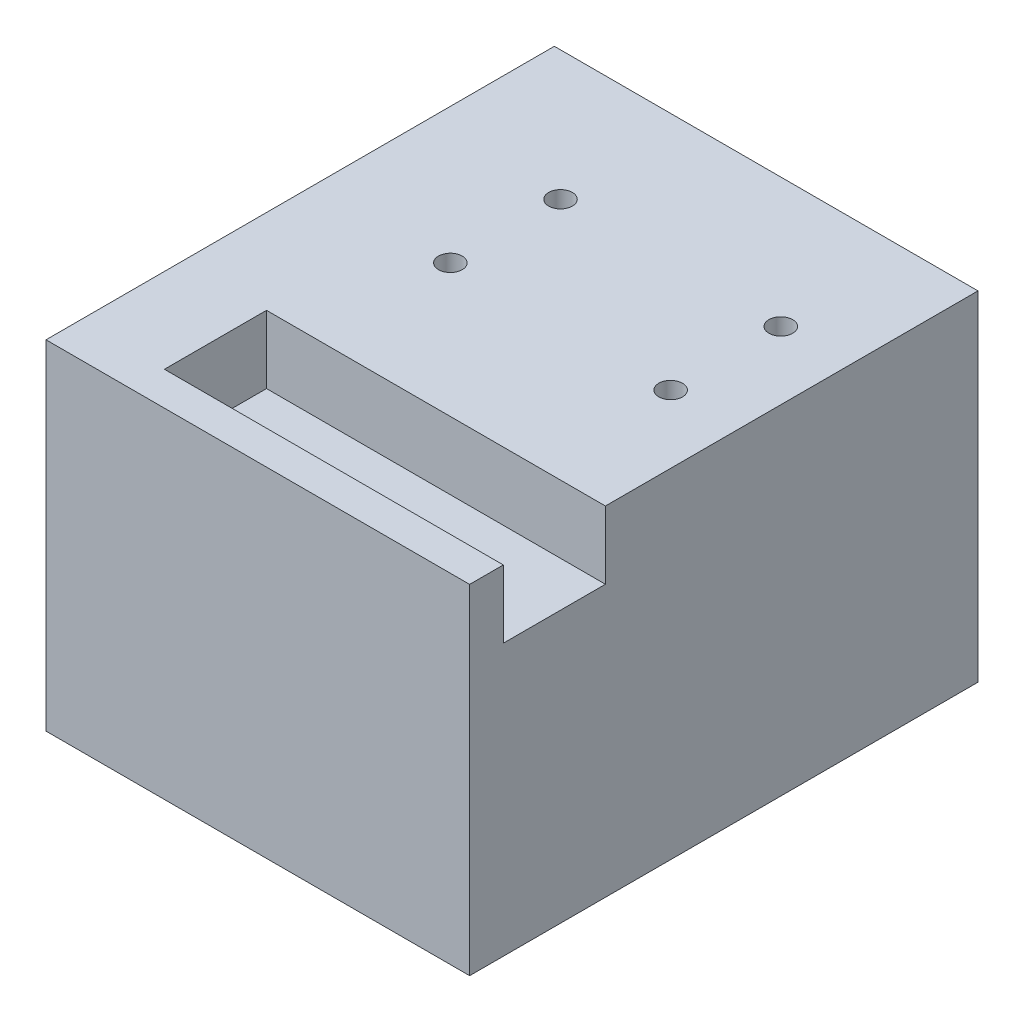
ISO-10303-21;
HEADER;
FILE_DESCRIPTION(('STEP AP214'),'2;1');
FILE_NAME('part.step','',(''),(''),'','','');
FILE_SCHEMA(('AUTOMOTIVE_DESIGN { 1 0 10303 214 1 1 1 1 }'));
ENDSEC;
DATA;
#1=APPLICATION_CONTEXT('core data for automotive mechanical design processes');
#2=APPLICATION_PROTOCOL_DEFINITION('international standard','automotive_design',2000,#1);
#3=PRODUCT_CONTEXT('',#1,'mechanical');
#4=PRODUCT('Part','Part','',(#3));
#5=PRODUCT_RELATED_PRODUCT_CATEGORY('part','',(#4));
#6=PRODUCT_DEFINITION_FORMATION('','',#4);
#7=PRODUCT_DEFINITION_CONTEXT('part definition',#1,'design');
#8=PRODUCT_DEFINITION('design','',#6,#7);
#9=PRODUCT_DEFINITION_SHAPE('','',#8);
#10=(LENGTH_UNIT() NAMED_UNIT(*) SI_UNIT(.MILLI.,.METRE.));
#11=(NAMED_UNIT(*) PLANE_ANGLE_UNIT() SI_UNIT($,.RADIAN.));
#12=(NAMED_UNIT(*) SI_UNIT($,.STERADIAN.) SOLID_ANGLE_UNIT());
#13=UNCERTAINTY_MEASURE_WITH_UNIT(LENGTH_MEASURE(1.E-05),#10,'distance_accuracy_value','');
#14=(GEOMETRIC_REPRESENTATION_CONTEXT(3) GLOBAL_UNCERTAINTY_ASSIGNED_CONTEXT((#13)) GLOBAL_UNIT_ASSIGNED_CONTEXT((#10,
#11,#12)) REPRESENTATION_CONTEXT('',''));
#15=CARTESIAN_POINT('',(0.,0.,0.));
#16=DIRECTION('',(0.,0.,1.));
#17=DIRECTION('',(1.,0.,0.));
#18=AXIS2_PLACEMENT_3D('',#15,#16,#17);
#19=CARTESIAN_POINT('',(0.,40.,0.));
#20=DIRECTION('',(0.,-1.,0.));
#21=DIRECTION('',(0.,0.,-1.));
#22=AXIS2_PLACEMENT_3D('',#19,#20,#21);
#23=PLANE('',#22);
#24=CARTESIAN_POINT('',(32.,40.,-34.725));
#25=DIRECTION('',(0.,1.,0.));
#26=DIRECTION('',(0.,0.,1.));
#27=AXIS2_PLACEMENT_3D('',#24,#25,#26);
#28=CIRCLE('',#27,1.4);
#29=CARTESIAN_POINT('',(32.,40.,-33.325));
#30=VERTEX_POINT('',#29);
#31=EDGE_CURVE('E148',#30,#30,#28,.T.);
#32=ORIENTED_EDGE('',*,*,#31,.F.);
#33=EDGE_LOOP('',(#32));
#34=FACE_BOUND('',#33,.T.);
#35=CARTESIAN_POINT('',(6.,40.,-21.725));
#36=DIRECTION('',(0.,1.,0.));
#37=DIRECTION('',(0.,0.,1.));
#38=AXIS2_PLACEMENT_3D('',#35,#36,#37);
#39=CIRCLE('',#38,1.4);
#40=CARTESIAN_POINT('',(6.,40.,-20.325));
#41=VERTEX_POINT('',#40);
#42=EDGE_CURVE('E157',#41,#41,#39,.T.);
#43=ORIENTED_EDGE('',*,*,#42,.F.);
#44=EDGE_LOOP('',(#43));
#45=FACE_BOUND('',#44,.T.);
#46=CARTESIAN_POINT('',(6.,40.,-34.725));
#47=DIRECTION('',(0.,1.,0.));
#48=DIRECTION('',(0.,0.,1.));
#49=AXIS2_PLACEMENT_3D('',#46,#47,#48);
#50=CIRCLE('',#49,1.4);
#51=CARTESIAN_POINT('',(6.,40.,-33.325));
#52=VERTEX_POINT('',#51);
#53=EDGE_CURVE('E140',#52,#52,#50,.T.);
#54=ORIENTED_EDGE('',*,*,#53,.F.);
#55=EDGE_LOOP('',(#54));
#56=FACE_BOUND('',#55,.T.);
#57=CARTESIAN_POINT('',(32.,40.,-21.725));
#58=DIRECTION('',(0.,1.,0.));
#59=DIRECTION('',(0.,0.,1.));
#60=AXIS2_PLACEMENT_3D('',#57,#58,#59);
#61=CIRCLE('',#60,1.4);
#62=CARTESIAN_POINT('',(32.,40.,-20.325));
#63=VERTEX_POINT('',#62);
#64=EDGE_CURVE('E152',#63,#63,#61,.T.);
#65=ORIENTED_EDGE('',*,*,#64,.F.);
#66=EDGE_LOOP('',(#65));
#67=FACE_BOUND('',#66,.T.);
#68=DIRECTION('',(-1.,0.,0.));
#69=VECTOR('',#68,1.);
#70=CARTESIAN_POINT('',(-10.,40.,10.));
#71=LINE('',#70,#69);
#72=CARTESIAN_POINT('',(40.,40.,10.));
#73=VERTEX_POINT('',#72);
#74=CARTESIAN_POINT('',(-10.,40.,10.));
#75=VERTEX_POINT('',#74);
#76=EDGE_CURVE('E63',#73,#75,#71,.T.);
#77=ORIENTED_EDGE('',*,*,#76,.F.);
#78=DIRECTION('',(0.,0.,-1.));
#79=VECTOR('',#78,1.);
#80=CARTESIAN_POINT('',(40.,40.,50.));
#81=LINE('',#80,#79);
#82=CARTESIAN_POINT('',(40.,40.,6.025));
#83=VERTEX_POINT('',#82);
#84=EDGE_CURVE('E212',#73,#83,#81,.T.);
#85=ORIENTED_EDGE('',*,*,#84,.T.);
#86=DIRECTION('',(1.,0.,0.));
#87=VECTOR('',#86,1.);
#88=CARTESIAN_POINT('',(0.,40.,6.025));
#89=LINE('',#88,#87);
#90=CARTESIAN_POINT('',(0.,40.,6.025));
#91=VERTEX_POINT('',#90);
#92=EDGE_CURVE('E168',#91,#83,#89,.T.);
#93=ORIENTED_EDGE('',*,*,#92,.F.);
#94=DIRECTION('',(0.,0.,1.));
#95=VECTOR('',#94,1.);
#96=CARTESIAN_POINT('',(0.,40.,-6.025));
#97=LINE('',#96,#95);
#98=CARTESIAN_POINT('',(0.,40.,-6.025));
#99=VERTEX_POINT('',#98);
#100=EDGE_CURVE('E177',#99,#91,#97,.T.);
#101=ORIENTED_EDGE('',*,*,#100,.F.);
#102=DIRECTION('',(-1.,0.,0.));
#103=VECTOR('',#102,1.);
#104=CARTESIAN_POINT('',(40.,40.,-6.02500000000002));
#105=LINE('',#104,#103);
#106=CARTESIAN_POINT('',(40.,40.,-6.02500000000002));
#107=VERTEX_POINT('',#106);
#108=EDGE_CURVE('E193',#107,#99,#105,.T.);
#109=ORIENTED_EDGE('',*,*,#108,.F.);
#110=CARTESIAN_POINT('',(40.,40.,-50.));
#111=VERTEX_POINT('',#110);
#112=EDGE_CURVE('E215',#107,#111,#81,.T.);
#113=ORIENTED_EDGE('',*,*,#112,.T.);
#114=DIRECTION('',(-1.,0.,0.));
#115=VECTOR('',#114,1.);
#116=CARTESIAN_POINT('',(-40.,40.,-50.));
#117=LINE('',#116,#115);
#118=CARTESIAN_POINT('',(-10.,40.,-50.));
#119=VERTEX_POINT('',#118);
#120=EDGE_CURVE('E56',#111,#119,#117,.T.);
#121=ORIENTED_EDGE('',*,*,#120,.T.);
#122=DIRECTION('',(0.,0.,-1.));
#123=VECTOR('',#122,1.);
#124=CARTESIAN_POINT('',(-10.,40.,-50.));
#125=LINE('',#124,#123);
#126=EDGE_CURVE('E131',#75,#119,#125,.T.);
#127=ORIENTED_EDGE('',*,*,#126,.F.);
#128=EDGE_LOOP('',(#77,#85,#93,#101,#109,#113,#121,#127));
#129=FACE_BOUND('',#128,.T.);
#130=ADVANCED_FACE('F47',(#34,#45,#56,#67,#129),#23,.F.);
#131=CARTESIAN_POINT('',(0.,0.,0.));
#132=DIRECTION('',(0.,-1.,0.));
#133=DIRECTION('',(0.,0.,-1.));
#134=AXIS2_PLACEMENT_3D('',#131,#132,#133);
#135=PLANE('',#134);
#136=DIRECTION('',(0.,0.,-1.));
#137=VECTOR('',#136,1.);
#138=CARTESIAN_POINT('',(40.,0.,50.));
#139=LINE('',#138,#137);
#140=CARTESIAN_POINT('',(40.,0.,10.));
#141=VERTEX_POINT('',#140);
#142=CARTESIAN_POINT('',(40.,0.,-50.));
#143=VERTEX_POINT('',#142);
#144=EDGE_CURVE('E125',#141,#143,#139,.T.);
#145=ORIENTED_EDGE('',*,*,#144,.F.);
#146=DIRECTION('',(1.,0.,0.));
#147=VECTOR('',#146,1.);
#148=CARTESIAN_POINT('',(-10.,0.,10.));
#149=LINE('',#148,#147);
#150=CARTESIAN_POINT('',(-10.,0.,10.));
#151=VERTEX_POINT('',#150);
#152=EDGE_CURVE('E114',#151,#141,#149,.T.);
#153=ORIENTED_EDGE('',*,*,#152,.F.);
#154=DIRECTION('',(0.,0.,1.));
#155=VECTOR('',#154,1.);
#156=CARTESIAN_POINT('',(-10.,0.,-50.));
#157=LINE('',#156,#155);
#158=CARTESIAN_POINT('',(-10.,0.,-50.));
#159=VERTEX_POINT('',#158);
#160=EDGE_CURVE('E123',#159,#151,#157,.T.);
#161=ORIENTED_EDGE('',*,*,#160,.F.);
#162=DIRECTION('',(-1.,0.,0.));
#163=VECTOR('',#162,1.);
#164=CARTESIAN_POINT('',(-40.,0.,-50.));
#165=LINE('',#164,#163);
#166=EDGE_CURVE('E220',#143,#159,#165,.T.);
#167=ORIENTED_EDGE('',*,*,#166,.F.);
#168=EDGE_LOOP('',(#145,#153,#161,#167));
#169=FACE_BOUND('',#168,.T.);
#170=ADVANCED_FACE('F121',(#169),#135,.T.);
#171=CARTESIAN_POINT('',(40.,40.,50.));
#172=DIRECTION('',(-1.,0.,0.));
#173=DIRECTION('',(0.,0.,1.));
#174=AXIS2_PLACEMENT_3D('',#171,#172,#173);
#175=PLANE('',#174);
#176=DIRECTION('',(0.,1.,0.));
#177=VECTOR('',#176,1.);
#178=CARTESIAN_POINT('',(40.,40.,10.));
#179=LINE('',#178,#177);
#180=EDGE_CURVE('E127',#141,#73,#179,.T.);
#181=ORIENTED_EDGE('',*,*,#180,.F.);
#182=ORIENTED_EDGE('',*,*,#144,.T.);
#183=DIRECTION('',(0.,-1.,0.));
#184=VECTOR('',#183,1.);
#185=CARTESIAN_POINT('',(40.,40.,-50.));
#186=LINE('',#185,#184);
#187=EDGE_CURVE('E11',#111,#143,#186,.T.);
#188=ORIENTED_EDGE('',*,*,#187,.F.);
#189=ORIENTED_EDGE('',*,*,#112,.F.);
#190=DIRECTION('',(0.,1.,0.));
#191=VECTOR('',#190,1.);
#192=CARTESIAN_POINT('',(40.,32.,-6.02500000000002));
#193=LINE('',#192,#191);
#194=CARTESIAN_POINT('',(40.,32.,-6.02500000000002));
#195=VERTEX_POINT('',#194);
#196=EDGE_CURVE('E206',#195,#107,#193,.T.);
#197=ORIENTED_EDGE('',*,*,#196,.F.);
#198=DIRECTION('',(0.,0.,-1.));
#199=VECTOR('',#198,1.);
#200=CARTESIAN_POINT('',(40.,32.,6.025));
#201=LINE('',#200,#199);
#202=CARTESIAN_POINT('',(40.,32.,6.025));
#203=VERTEX_POINT('',#202);
#204=EDGE_CURVE('E176',#203,#195,#201,.T.);
#205=ORIENTED_EDGE('',*,*,#204,.F.);
#206=DIRECTION('',(0.,1.,0.));
#207=VECTOR('',#206,1.);
#208=CARTESIAN_POINT('',(40.,32.,6.025));
#209=LINE('',#208,#207);
#210=EDGE_CURVE('E189',#203,#83,#209,.T.);
#211=ORIENTED_EDGE('',*,*,#210,.T.);
#212=ORIENTED_EDGE('',*,*,#84,.F.);
#213=EDGE_LOOP('',(#181,#182,#188,#189,#197,#205,#211,#212));
#214=FACE_BOUND('',#213,.T.);
#215=ADVANCED_FACE('F49',(#214),#175,.F.);
#216=CARTESIAN_POINT('',(-10.,0.,0.));
#217=DIRECTION('',(-1.,0.,0.));
#218=DIRECTION('',(0.,0.,1.));
#219=AXIS2_PLACEMENT_3D('',#216,#217,#218);
#220=PLANE('',#219);
#221=ORIENTED_EDGE('',*,*,#160,.T.);
#222=DIRECTION('',(0.,-1.,0.));
#223=VECTOR('',#222,1.);
#224=CARTESIAN_POINT('',(-10.,40.,10.));
#225=LINE('',#224,#223);
#226=EDGE_CURVE('E111',#75,#151,#225,.T.);
#227=ORIENTED_EDGE('',*,*,#226,.F.);
#228=ORIENTED_EDGE('',*,*,#126,.T.);
#229=DIRECTION('',(0.,-1.,0.));
#230=VECTOR('',#229,1.);
#231=CARTESIAN_POINT('',(-10.,40.,-50.));
#232=LINE('',#231,#230);
#233=EDGE_CURVE('E71',#119,#159,#232,.T.);
#234=ORIENTED_EDGE('',*,*,#233,.T.);
#235=EDGE_LOOP('',(#221,#227,#228,#234));
#236=FACE_BOUND('',#235,.T.);
#237=ADVANCED_FACE('F129',(#236),#220,.T.);
#238=CARTESIAN_POINT('',(-40.,40.,-50.));
#239=DIRECTION('',(0.,0.,1.));
#240=DIRECTION('',(1.,0.,0.));
#241=AXIS2_PLACEMENT_3D('',#238,#239,#240);
#242=PLANE('',#241);
#243=ORIENTED_EDGE('',*,*,#233,.F.);
#244=ORIENTED_EDGE('',*,*,#120,.F.);
#245=ORIENTED_EDGE('',*,*,#187,.T.);
#246=ORIENTED_EDGE('',*,*,#166,.T.);
#247=EDGE_LOOP('',(#243,#244,#245,#246));
#248=FACE_BOUND('',#247,.T.);
#249=ADVANCED_FACE('F232',(#248),#242,.F.);
#250=CARTESIAN_POINT('',(0.,32.,6.025));
#251=DIRECTION('',(0.,0.,1.));
#252=DIRECTION('',(1.,0.,0.));
#253=AXIS2_PLACEMENT_3D('',#250,#251,#252);
#254=PLANE('',#253);
#255=ORIENTED_EDGE('',*,*,#92,.T.);
#256=ORIENTED_EDGE('',*,*,#210,.F.);
#257=DIRECTION('',(1.,0.,0.));
#258=VECTOR('',#257,1.);
#259=CARTESIAN_POINT('',(0.,32.,6.025));
#260=LINE('',#259,#258);
#261=CARTESIAN_POINT('',(0.,32.,6.025));
#262=VERTEX_POINT('',#261);
#263=EDGE_CURVE('E172',#262,#203,#260,.T.);
#264=ORIENTED_EDGE('',*,*,#263,.F.);
#265=DIRECTION('',(0.,1.,0.));
#266=VECTOR('',#265,1.);
#267=CARTESIAN_POINT('',(0.,32.,6.025));
#268=LINE('',#267,#266);
#269=EDGE_CURVE('E200',#262,#91,#268,.T.);
#270=ORIENTED_EDGE('',*,*,#269,.T.);
#271=EDGE_LOOP('',(#255,#256,#264,#270));
#272=FACE_BOUND('',#271,.T.);
#273=ADVANCED_FACE('F239',(#272),#254,.F.);
#274=CARTESIAN_POINT('',(0.,32.,-6.025));
#275=DIRECTION('',(-1.,0.,0.));
#276=DIRECTION('',(0.,0.,1.));
#277=AXIS2_PLACEMENT_3D('',#274,#275,#276);
#278=PLANE('',#277);
#279=ORIENTED_EDGE('',*,*,#100,.T.);
#280=ORIENTED_EDGE('',*,*,#269,.F.);
#281=DIRECTION('',(0.,0.,1.));
#282=VECTOR('',#281,1.);
#283=CARTESIAN_POINT('',(0.,32.,-6.025));
#284=LINE('',#283,#282);
#285=CARTESIAN_POINT('',(0.,32.,-6.025));
#286=VERTEX_POINT('',#285);
#287=EDGE_CURVE('E185',#286,#262,#284,.T.);
#288=ORIENTED_EDGE('',*,*,#287,.F.);
#289=DIRECTION('',(0.,1.,0.));
#290=VECTOR('',#289,1.);
#291=CARTESIAN_POINT('',(0.,32.,-6.025));
#292=LINE('',#291,#290);
#293=EDGE_CURVE('E203',#286,#99,#292,.T.);
#294=ORIENTED_EDGE('',*,*,#293,.T.);
#295=EDGE_LOOP('',(#279,#280,#288,#294));
#296=FACE_BOUND('',#295,.T.);
#297=ADVANCED_FACE('F246',(#296),#278,.F.);
#298=CARTESIAN_POINT('',(40.,32.,-6.02500000000002));
#299=DIRECTION('',(0.,0.,-1.));
#300=DIRECTION('',(-1.,0.,0.));
#301=AXIS2_PLACEMENT_3D('',#298,#299,#300);
#302=PLANE('',#301);
#303=ORIENTED_EDGE('',*,*,#108,.T.);
#304=ORIENTED_EDGE('',*,*,#293,.F.);
#305=DIRECTION('',(-1.,0.,0.));
#306=VECTOR('',#305,1.);
#307=CARTESIAN_POINT('',(40.,32.,-6.02500000000002));
#308=LINE('',#307,#306);
#309=EDGE_CURVE('E181',#195,#286,#308,.T.);
#310=ORIENTED_EDGE('',*,*,#309,.F.);
#311=ORIENTED_EDGE('',*,*,#196,.T.);
#312=EDGE_LOOP('',(#303,#304,#310,#311));
#313=FACE_BOUND('',#312,.T.);
#314=ADVANCED_FACE('F248',(#313),#302,.F.);
#315=CARTESIAN_POINT('',(0.,32.,0.));
#316=DIRECTION('',(0.,1.,0.));
#317=DIRECTION('',(0.,0.,1.));
#318=AXIS2_PLACEMENT_3D('',#315,#316,#317);
#319=PLANE('',#318);
#320=ORIENTED_EDGE('',*,*,#263,.T.);
#321=ORIENTED_EDGE('',*,*,#204,.T.);
#322=ORIENTED_EDGE('',*,*,#309,.T.);
#323=ORIENTED_EDGE('',*,*,#287,.T.);
#324=EDGE_LOOP('',(#320,#321,#322,#323));
#325=FACE_BOUND('',#324,.T.);
#326=ADVANCED_FACE('F243',(#325),#319,.T.);
#327=CARTESIAN_POINT('',(32.,38.,-21.725));
#328=DIRECTION('',(0.,1.,0.));
#329=DIRECTION('',(0.,0.,1.));
#330=AXIS2_PLACEMENT_3D('',#327,#328,#329);
#331=CYLINDRICAL_SURFACE('',#330,1.4);
#332=CARTESIAN_POINT('',(32.,38.,-21.725));
#333=DIRECTION('',(0.,1.,0.));
#334=DIRECTION('',(0.,0.,1.));
#335=AXIS2_PLACEMENT_3D('',#332,#333,#334);
#336=CIRCLE('',#335,1.4);
#337=CARTESIAN_POINT('',(32.,38.,-20.325));
#338=VERTEX_POINT('',#337);
#339=EDGE_CURVE('E164',#338,#338,#336,.T.);
#340=ORIENTED_EDGE('',*,*,#339,.F.);
#341=EDGE_LOOP('',(#340));
#342=FACE_BOUND('',#341,.T.);
#343=ORIENTED_EDGE('',*,*,#64,.T.);
#344=EDGE_LOOP('',(#343));
#345=FACE_BOUND('',#344,.T.);
#346=ADVANCED_FACE('F255',(#342,#345),#331,.F.);
#347=CARTESIAN_POINT('',(32.,38.,-21.725));
#348=DIRECTION('',(0.,1.,0.));
#349=DIRECTION('',(0.,0.,1.));
#350=AXIS2_PLACEMENT_3D('',#347,#348,#349);
#351=PLANE('',#350);
#352=ORIENTED_EDGE('',*,*,#339,.T.);
#353=EDGE_LOOP('',(#352));
#354=FACE_BOUND('',#353,.T.);
#355=ADVANCED_FACE('F285',(#354),#351,.T.);
#356=CARTESIAN_POINT('',(6.,38.,-34.725));
#357=DIRECTION('',(0.,1.,0.));
#358=DIRECTION('',(0.,0.,1.));
#359=AXIS2_PLACEMENT_3D('',#356,#357,#358);
#360=CYLINDRICAL_SURFACE('',#359,1.4);
#361=CARTESIAN_POINT('',(6.,38.,-34.725));
#362=DIRECTION('',(0.,1.,0.));
#363=DIRECTION('',(0.,0.,1.));
#364=AXIS2_PLACEMENT_3D('',#361,#362,#363);
#365=CIRCLE('',#364,1.4);
#366=CARTESIAN_POINT('',(6.,38.,-33.325));
#367=VERTEX_POINT('',#366);
#368=EDGE_CURVE('E135',#367,#367,#365,.T.);
#369=ORIENTED_EDGE('',*,*,#368,.F.);
#370=EDGE_LOOP('',(#369));
#371=FACE_BOUND('',#370,.T.);
#372=ORIENTED_EDGE('',*,*,#53,.T.);
#373=EDGE_LOOP('',(#372));
#374=FACE_BOUND('',#373,.T.);
#375=ADVANCED_FACE('F281',(#371,#374),#360,.F.);
#376=CARTESIAN_POINT('',(6.,38.,-34.725));
#377=DIRECTION('',(0.,1.,0.));
#378=DIRECTION('',(0.,0.,1.));
#379=AXIS2_PLACEMENT_3D('',#376,#377,#378);
#380=PLANE('',#379);
#381=ORIENTED_EDGE('',*,*,#368,.T.);
#382=EDGE_LOOP('',(#381));
#383=FACE_BOUND('',#382,.T.);
#384=ADVANCED_FACE('F284',(#383),#380,.T.);
#385=CARTESIAN_POINT('',(6.,38.,-21.725));
#386=DIRECTION('',(0.,1.,0.));
#387=DIRECTION('',(0.,0.,1.));
#388=AXIS2_PLACEMENT_3D('',#385,#386,#387);
#389=CYLINDRICAL_SURFACE('',#388,1.4);
#390=CARTESIAN_POINT('',(6.,38.,-21.725));
#391=DIRECTION('',(0.,1.,0.));
#392=DIRECTION('',(0.,0.,1.));
#393=AXIS2_PLACEMENT_3D('',#390,#391,#392);
#394=CIRCLE('',#393,1.4);
#395=CARTESIAN_POINT('',(6.,38.,-20.325));
#396=VERTEX_POINT('',#395);
#397=EDGE_CURVE('E144',#396,#396,#394,.T.);
#398=ORIENTED_EDGE('',*,*,#397,.F.);
#399=EDGE_LOOP('',(#398));
#400=FACE_BOUND('',#399,.T.);
#401=ORIENTED_EDGE('',*,*,#42,.T.);
#402=EDGE_LOOP('',(#401));
#403=FACE_BOUND('',#402,.T.);
#404=ADVANCED_FACE('F289',(#400,#403),#389,.F.);
#405=CARTESIAN_POINT('',(6.,38.,-21.725));
#406=DIRECTION('',(0.,1.,0.));
#407=DIRECTION('',(0.,0.,1.));
#408=AXIS2_PLACEMENT_3D('',#405,#406,#407);
#409=PLANE('',#408);
#410=ORIENTED_EDGE('',*,*,#397,.T.);
#411=EDGE_LOOP('',(#410));
#412=FACE_BOUND('',#411,.T.);
#413=ADVANCED_FACE('F295',(#412),#409,.T.);
#414=CARTESIAN_POINT('',(32.,38.,-34.725));
#415=DIRECTION('',(0.,1.,0.));
#416=DIRECTION('',(0.,0.,1.));
#417=AXIS2_PLACEMENT_3D('',#414,#415,#416);
#418=CYLINDRICAL_SURFACE('',#417,1.4);
#419=CARTESIAN_POINT('',(32.,38.,-34.725));
#420=DIRECTION('',(0.,1.,0.));
#421=DIRECTION('',(0.,0.,1.));
#422=AXIS2_PLACEMENT_3D('',#419,#420,#421);
#423=CIRCLE('',#422,1.4);
#424=CARTESIAN_POINT('',(32.,38.,-33.325));
#425=VERTEX_POINT('',#424);
#426=EDGE_CURVE('E153',#425,#425,#423,.T.);
#427=ORIENTED_EDGE('',*,*,#426,.F.);
#428=EDGE_LOOP('',(#427));
#429=FACE_BOUND('',#428,.T.);
#430=ORIENTED_EDGE('',*,*,#31,.T.);
#431=EDGE_LOOP('',(#430));
#432=FACE_BOUND('',#431,.T.);
#433=ADVANCED_FACE('F291',(#429,#432),#418,.F.);
#434=CARTESIAN_POINT('',(32.,38.,-34.725));
#435=DIRECTION('',(0.,1.,0.));
#436=DIRECTION('',(0.,0.,1.));
#437=AXIS2_PLACEMENT_3D('',#434,#435,#436);
#438=PLANE('',#437);
#439=ORIENTED_EDGE('',*,*,#426,.T.);
#440=EDGE_LOOP('',(#439));
#441=FACE_BOUND('',#440,.T.);
#442=ADVANCED_FACE('F294',(#441),#438,.T.);
#443=CARTESIAN_POINT('',(0.,0.,10.));
#444=DIRECTION('',(0.,0.,1.));
#445=DIRECTION('',(1.,0.,0.));
#446=AXIS2_PLACEMENT_3D('',#443,#444,#445);
#447=PLANE('',#446);
#448=ORIENTED_EDGE('',*,*,#226,.T.);
#449=ORIENTED_EDGE('',*,*,#152,.T.);
#450=ORIENTED_EDGE('',*,*,#180,.T.);
#451=ORIENTED_EDGE('',*,*,#76,.T.);
#452=EDGE_LOOP('',(#448,#449,#450,#451));
#453=FACE_BOUND('',#452,.T.);
#454=ADVANCED_FACE('F113',(#453),#447,.T.);
#455=CLOSED_SHELL('',(#130,#170,#215,#237,#249,#273,#297,#314,#326,#346,#355,#375,#384,#404,
#413,#433,#442,#454));
#456=MANIFOLD_SOLID_BREP('B2',#455);
#457=ADVANCED_BREP_SHAPE_REPRESENTATION('',(#18,#456),#14);
#458=SHAPE_DEFINITION_REPRESENTATION(#9,#457);
ENDSEC;
END-ISO-10303-21;
